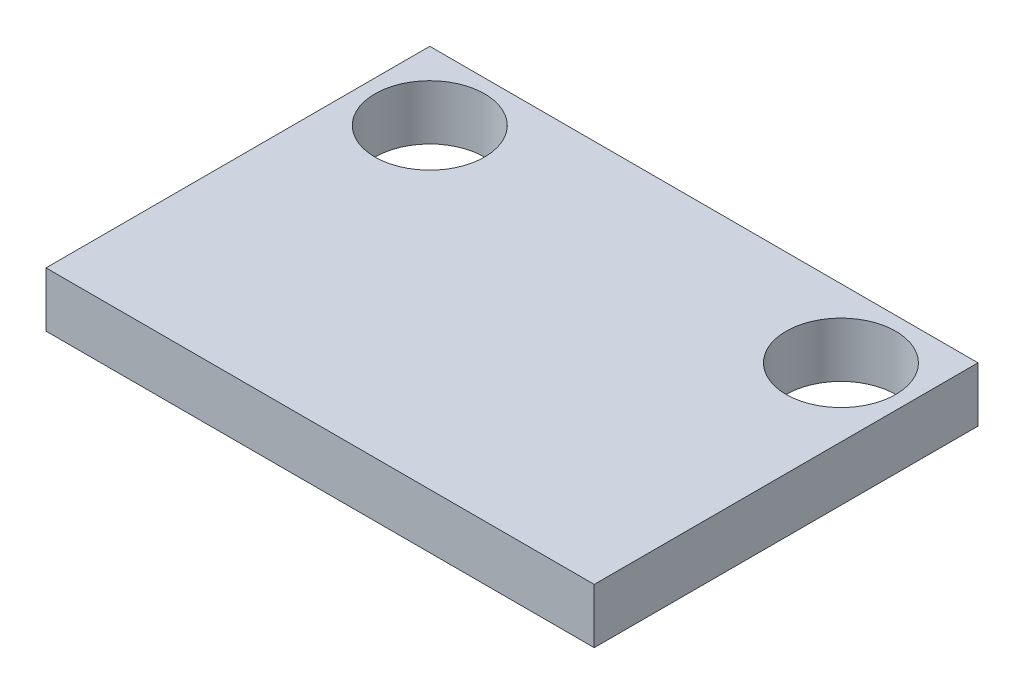
ISO-10303-21;
HEADER;
FILE_DESCRIPTION(('STEP AP214'),'2;1');
FILE_NAME('part.step','',(''),(''),'','','');
FILE_SCHEMA(('AUTOMOTIVE_DESIGN { 1 0 10303 214 1 1 1 1 }'));
ENDSEC;
DATA;
#1=APPLICATION_CONTEXT('core data for automotive mechanical design processes');
#2=APPLICATION_PROTOCOL_DEFINITION('international standard','automotive_design',2000,#1);
#3=PRODUCT_CONTEXT('',#1,'mechanical');
#4=PRODUCT('Part','Part','',(#3));
#5=PRODUCT_RELATED_PRODUCT_CATEGORY('part','',(#4));
#6=PRODUCT_DEFINITION_FORMATION('','',#4);
#7=PRODUCT_DEFINITION_CONTEXT('part definition',#1,'design');
#8=PRODUCT_DEFINITION('design','',#6,#7);
#9=PRODUCT_DEFINITION_SHAPE('','',#8);
#10=(LENGTH_UNIT() NAMED_UNIT(*) SI_UNIT(.MILLI.,.METRE.));
#11=(NAMED_UNIT(*) PLANE_ANGLE_UNIT() SI_UNIT($,.RADIAN.));
#12=(NAMED_UNIT(*) SI_UNIT($,.STERADIAN.) SOLID_ANGLE_UNIT());
#13=UNCERTAINTY_MEASURE_WITH_UNIT(LENGTH_MEASURE(1.E-05),#10,'distance_accuracy_value','');
#14=(GEOMETRIC_REPRESENTATION_CONTEXT(3) GLOBAL_UNCERTAINTY_ASSIGNED_CONTEXT((#13)) GLOBAL_UNIT_ASSIGNED_CONTEXT((#10,
#11,#12)) REPRESENTATION_CONTEXT('',''));
#15=CARTESIAN_POINT('',(0.,0.,0.));
#16=DIRECTION('',(0.,0.,1.));
#17=DIRECTION('',(1.,0.,0.));
#18=AXIS2_PLACEMENT_3D('',#15,#16,#17);
#19=CARTESIAN_POINT('',(0.,2.,0.));
#20=DIRECTION('',(0.,1.,0.));
#21=DIRECTION('',(0.,0.,1.));
#22=AXIS2_PLACEMENT_3D('',#19,#20,#21);
#23=PLANE('',#22);
#24=CARTESIAN_POINT('',(-7.5,2.,-4.5));
#25=DIRECTION('',(0.,1.,0.));
#26=DIRECTION('',(0.,0.,1.));
#27=AXIS2_PLACEMENT_3D('',#24,#25,#26);
#28=CIRCLE('',#27,2.);
#29=CARTESIAN_POINT('',(-7.5,2.,-2.5));
#30=VERTEX_POINT('',#29);
#31=EDGE_CURVE('E107',#30,#30,#28,.T.);
#32=ORIENTED_EDGE('',*,*,#31,.F.);
#33=EDGE_LOOP('',(#32));
#34=FACE_BOUND('',#33,.T.);
#35=DIRECTION('',(0.,0.,-1.));
#36=VECTOR('',#35,1.);
#37=CARTESIAN_POINT('',(10.,2.,-7.));
#38=LINE('',#37,#36);
#39=CARTESIAN_POINT('',(10.,2.,7.));
#40=VERTEX_POINT('',#39);
#41=CARTESIAN_POINT('',(10.,2.,-7.));
#42=VERTEX_POINT('',#41);
#43=EDGE_CURVE('E92',#40,#42,#38,.T.);
#44=ORIENTED_EDGE('',*,*,#43,.T.);
#45=DIRECTION('',(-1.,0.,0.));
#46=VECTOR('',#45,1.);
#47=CARTESIAN_POINT('',(-10.,2.,-7.));
#48=LINE('',#47,#46);
#49=CARTESIAN_POINT('',(-10.,2.,-7.));
#50=VERTEX_POINT('',#49);
#51=EDGE_CURVE('E87',#42,#50,#48,.T.);
#52=ORIENTED_EDGE('',*,*,#51,.T.);
#53=DIRECTION('',(0.,0.,1.));
#54=VECTOR('',#53,1.);
#55=CARTESIAN_POINT('',(-10.,2.,-7.));
#56=LINE('',#55,#54);
#57=CARTESIAN_POINT('',(-10.,2.,7.));
#58=VERTEX_POINT('',#57);
#59=EDGE_CURVE('E90',#50,#58,#56,.T.);
#60=ORIENTED_EDGE('',*,*,#59,.T.);
#61=DIRECTION('',(1.,0.,0.));
#62=VECTOR('',#61,1.);
#63=CARTESIAN_POINT('',(-10.,2.,7.));
#64=LINE('',#63,#62);
#65=EDGE_CURVE('E57',#58,#40,#64,.T.);
#66=ORIENTED_EDGE('',*,*,#65,.T.);
#67=EDGE_LOOP('',(#44,#52,#60,#66));
#68=FACE_BOUND('',#67,.T.);
#69=CARTESIAN_POINT('',(7.5,2.,-4.5));
#70=DIRECTION('',(0.,1.,0.));
#71=DIRECTION('',(0.,0.,1.));
#72=AXIS2_PLACEMENT_3D('',#69,#70,#71);
#73=CIRCLE('',#72,2.);
#74=CARTESIAN_POINT('',(7.5,2.,-2.5));
#75=VERTEX_POINT('',#74);
#76=EDGE_CURVE('E122',#75,#75,#73,.T.);
#77=ORIENTED_EDGE('',*,*,#76,.F.);
#78=EDGE_LOOP('',(#77));
#79=FACE_BOUND('',#78,.T.);
#80=ADVANCED_FACE('F40',(#34,#68,#79),#23,.T.);
#81=CARTESIAN_POINT('',(0.,0.,0.));
#82=DIRECTION('',(0.,1.,0.));
#83=DIRECTION('',(0.,0.,1.));
#84=AXIS2_PLACEMENT_3D('',#81,#82,#83);
#85=PLANE('',#84);
#86=DIRECTION('',(0.,0.,-1.));
#87=VECTOR('',#86,1.);
#88=CARTESIAN_POINT('',(10.,0.,-7.));
#89=LINE('',#88,#87);
#90=CARTESIAN_POINT('',(10.,0.,7.));
#91=VERTEX_POINT('',#90);
#92=CARTESIAN_POINT('',(10.,0.,-7.));
#93=VERTEX_POINT('',#92);
#94=EDGE_CURVE('E104',#91,#93,#89,.T.);
#95=ORIENTED_EDGE('',*,*,#94,.F.);
#96=DIRECTION('',(1.,0.,0.));
#97=VECTOR('',#96,1.);
#98=CARTESIAN_POINT('',(-10.,0.,7.));
#99=LINE('',#98,#97);
#100=CARTESIAN_POINT('',(-10.,0.,7.));
#101=VERTEX_POINT('',#100);
#102=EDGE_CURVE('E80',#101,#91,#99,.T.);
#103=ORIENTED_EDGE('',*,*,#102,.F.);
#104=DIRECTION('',(0.,0.,1.));
#105=VECTOR('',#104,1.);
#106=CARTESIAN_POINT('',(-10.,0.,-7.));
#107=LINE('',#106,#105);
#108=CARTESIAN_POINT('',(-10.,0.,-7.));
#109=VERTEX_POINT('',#108);
#110=EDGE_CURVE('E74',#109,#101,#107,.T.);
#111=ORIENTED_EDGE('',*,*,#110,.F.);
#112=DIRECTION('',(-1.,0.,0.));
#113=VECTOR('',#112,1.);
#114=CARTESIAN_POINT('',(-10.,0.,-7.));
#115=LINE('',#114,#113);
#116=EDGE_CURVE('E96',#93,#109,#115,.T.);
#117=ORIENTED_EDGE('',*,*,#116,.F.);
#118=EDGE_LOOP('',(#95,#103,#111,#117));
#119=FACE_BOUND('',#118,.T.);
#120=CARTESIAN_POINT('',(-7.5,0.,-4.5));
#121=DIRECTION('',(0.,1.,0.));
#122=DIRECTION('',(0.,0.,1.));
#123=AXIS2_PLACEMENT_3D('',#120,#121,#122);
#124=CIRCLE('',#123,2.);
#125=CARTESIAN_POINT('',(-7.5,0.,-2.5));
#126=VERTEX_POINT('',#125);
#127=EDGE_CURVE('E119',#126,#126,#124,.T.);
#128=ORIENTED_EDGE('',*,*,#127,.T.);
#129=EDGE_LOOP('',(#128));
#130=FACE_BOUND('',#129,.T.);
#131=CARTESIAN_POINT('',(7.5,0.,-4.5));
#132=DIRECTION('',(0.,1.,0.));
#133=DIRECTION('',(0.,0.,1.));
#134=AXIS2_PLACEMENT_3D('',#131,#132,#133);
#135=CIRCLE('',#134,2.);
#136=CARTESIAN_POINT('',(7.5,0.,-2.5));
#137=VERTEX_POINT('',#136);
#138=EDGE_CURVE('E125',#137,#137,#135,.T.);
#139=ORIENTED_EDGE('',*,*,#138,.T.);
#140=EDGE_LOOP('',(#139));
#141=FACE_BOUND('',#140,.T.);
#142=ADVANCED_FACE('F115',(#119,#130,#141),#85,.F.);
#143=CARTESIAN_POINT('',(10.,2.,-7.));
#144=DIRECTION('',(-1.,0.,0.));
#145=DIRECTION('',(0.,0.,1.));
#146=AXIS2_PLACEMENT_3D('',#143,#144,#145);
#147=PLANE('',#146);
#148=ORIENTED_EDGE('',*,*,#94,.T.);
#149=DIRECTION('',(0.,-1.,0.));
#150=VECTOR('',#149,1.);
#151=CARTESIAN_POINT('',(10.,2.,-7.));
#152=LINE('',#151,#150);
#153=EDGE_CURVE('E11',#42,#93,#152,.T.);
#154=ORIENTED_EDGE('',*,*,#153,.F.);
#155=ORIENTED_EDGE('',*,*,#43,.F.);
#156=DIRECTION('',(0.,-1.,0.));
#157=VECTOR('',#156,1.);
#158=CARTESIAN_POINT('',(10.,2.,7.));
#159=LINE('',#158,#157);
#160=EDGE_CURVE('E100',#40,#91,#159,.T.);
#161=ORIENTED_EDGE('',*,*,#160,.T.);
#162=EDGE_LOOP('',(#148,#154,#155,#161));
#163=FACE_BOUND('',#162,.T.);
#164=ADVANCED_FACE('F42',(#163),#147,.F.);
#165=CARTESIAN_POINT('',(-10.,2.,-7.));
#166=DIRECTION('',(0.,0.,1.));
#167=DIRECTION('',(1.,0.,0.));
#168=AXIS2_PLACEMENT_3D('',#165,#166,#167);
#169=PLANE('',#168);
#170=ORIENTED_EDGE('',*,*,#116,.T.);
#171=DIRECTION('',(0.,-1.,0.));
#172=VECTOR('',#171,1.);
#173=CARTESIAN_POINT('',(-10.,2.,-7.));
#174=LINE('',#173,#172);
#175=EDGE_CURVE('E49',#50,#109,#174,.T.);
#176=ORIENTED_EDGE('',*,*,#175,.F.);
#177=ORIENTED_EDGE('',*,*,#51,.F.);
#178=ORIENTED_EDGE('',*,*,#153,.T.);
#179=EDGE_LOOP('',(#170,#176,#177,#178));
#180=FACE_BOUND('',#179,.T.);
#181=ADVANCED_FACE('F95',(#180),#169,.F.);
#182=CARTESIAN_POINT('',(-10.,2.,-7.));
#183=DIRECTION('',(1.,0.,0.));
#184=DIRECTION('',(0.,0.,-1.));
#185=AXIS2_PLACEMENT_3D('',#182,#183,#184);
#186=PLANE('',#185);
#187=ORIENTED_EDGE('',*,*,#110,.T.);
#188=DIRECTION('',(0.,-1.,0.));
#189=VECTOR('',#188,1.);
#190=CARTESIAN_POINT('',(-10.,2.,7.));
#191=LINE('',#190,#189);
#192=EDGE_CURVE('E97',#58,#101,#191,.T.);
#193=ORIENTED_EDGE('',*,*,#192,.F.);
#194=ORIENTED_EDGE('',*,*,#59,.F.);
#195=ORIENTED_EDGE('',*,*,#175,.T.);
#196=EDGE_LOOP('',(#187,#193,#194,#195));
#197=FACE_BOUND('',#196,.T.);
#198=ADVANCED_FACE('F98',(#197),#186,.F.);
#199=CARTESIAN_POINT('',(-10.,2.,7.));
#200=DIRECTION('',(0.,0.,-1.));
#201=DIRECTION('',(-1.,0.,0.));
#202=AXIS2_PLACEMENT_3D('',#199,#200,#201);
#203=PLANE('',#202);
#204=ORIENTED_EDGE('',*,*,#102,.T.);
#205=ORIENTED_EDGE('',*,*,#160,.F.);
#206=ORIENTED_EDGE('',*,*,#65,.F.);
#207=ORIENTED_EDGE('',*,*,#192,.T.);
#208=EDGE_LOOP('',(#204,#205,#206,#207));
#209=FACE_BOUND('',#208,.T.);
#210=ADVANCED_FACE('F112',(#209),#203,.F.);
#211=CARTESIAN_POINT('',(-7.5,2.,-4.5));
#212=DIRECTION('',(0.,-1.,0.));
#213=DIRECTION('',(0.,0.,-1.));
#214=AXIS2_PLACEMENT_3D('',#211,#212,#213);
#215=CYLINDRICAL_SURFACE('',#214,2.);
#216=ORIENTED_EDGE('',*,*,#31,.T.);
#217=EDGE_LOOP('',(#216));
#218=FACE_BOUND('',#217,.T.);
#219=ORIENTED_EDGE('',*,*,#127,.F.);
#220=EDGE_LOOP('',(#219));
#221=FACE_BOUND('',#220,.T.);
#222=ADVANCED_FACE('F142',(#218,#221),#215,.F.);
#223=CARTESIAN_POINT('',(7.5,2.,-4.5));
#224=DIRECTION('',(0.,-1.,0.));
#225=DIRECTION('',(0.,0.,-1.));
#226=AXIS2_PLACEMENT_3D('',#223,#224,#225);
#227=CYLINDRICAL_SURFACE('',#226,2.);
#228=ORIENTED_EDGE('',*,*,#76,.T.);
#229=EDGE_LOOP('',(#228));
#230=FACE_BOUND('',#229,.T.);
#231=ORIENTED_EDGE('',*,*,#138,.F.);
#232=EDGE_LOOP('',(#231));
#233=FACE_BOUND('',#232,.T.);
#234=ADVANCED_FACE('F131',(#230,#233),#227,.F.);
#235=CLOSED_SHELL('',(#80,#142,#164,#181,#198,#210,#222,#234));
#236=MANIFOLD_SOLID_BREP('B2',#235);
#237=ADVANCED_BREP_SHAPE_REPRESENTATION('',(#18,#236),#14);
#238=SHAPE_DEFINITION_REPRESENTATION(#9,#237);
ENDSEC;
END-ISO-10303-21;
